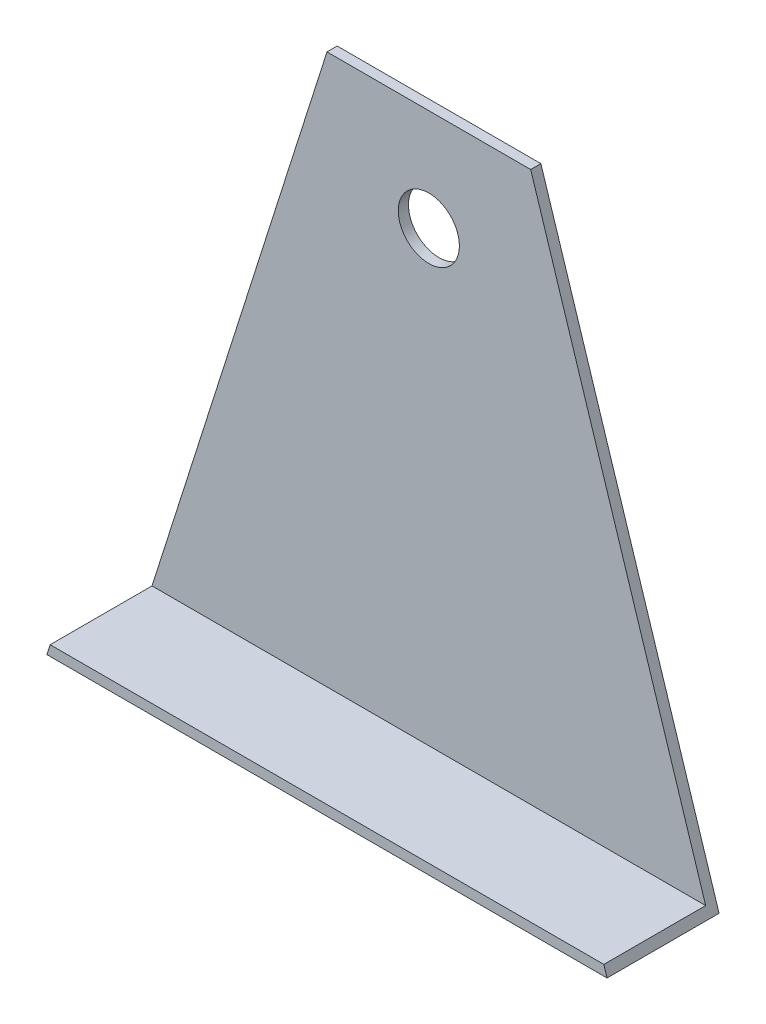
ISO-10303-21;
HEADER;
FILE_DESCRIPTION(('STEP AP214'),'2;1');
FILE_NAME('part.step','',(''),(''),'','','');
FILE_SCHEMA(('AUTOMOTIVE_DESIGN { 1 0 10303 214 1 1 1 1 }'));
ENDSEC;
DATA;
#1=APPLICATION_CONTEXT('core data for automotive mechanical design processes');
#2=APPLICATION_PROTOCOL_DEFINITION('international standard','automotive_design',2000,#1);
#3=PRODUCT_CONTEXT('',#1,'mechanical');
#4=PRODUCT('Part','Part','',(#3));
#5=PRODUCT_RELATED_PRODUCT_CATEGORY('part','',(#4));
#6=PRODUCT_DEFINITION_FORMATION('','',#4);
#7=PRODUCT_DEFINITION_CONTEXT('part definition',#1,'design');
#8=PRODUCT_DEFINITION('design','',#6,#7);
#9=PRODUCT_DEFINITION_SHAPE('','',#8);
#10=(LENGTH_UNIT() NAMED_UNIT(*) SI_UNIT(.MILLI.,.METRE.));
#11=(NAMED_UNIT(*) PLANE_ANGLE_UNIT() SI_UNIT($,.RADIAN.));
#12=(NAMED_UNIT(*) SI_UNIT($,.STERADIAN.) SOLID_ANGLE_UNIT());
#13=UNCERTAINTY_MEASURE_WITH_UNIT(LENGTH_MEASURE(1.E-05),#10,'distance_accuracy_value','');
#14=(GEOMETRIC_REPRESENTATION_CONTEXT(3) GLOBAL_UNCERTAINTY_ASSIGNED_CONTEXT((#13)) GLOBAL_UNIT_ASSIGNED_CONTEXT((#10,
#11,#12)) REPRESENTATION_CONTEXT('',''));
#15=CARTESIAN_POINT('',(0.,0.,0.));
#16=DIRECTION('',(0.,0.,1.));
#17=DIRECTION('',(1.,0.,0.));
#18=AXIS2_PLACEMENT_3D('',#15,#16,#17);
#19=CARTESIAN_POINT('',(-20.,110.,2.));
#20=DIRECTION('',(0.952925780013262,-0.303203657276947,0.));
#21=DIRECTION('',(0.303203657276947,0.952925780013262,0.));
#22=AXIS2_PLACEMENT_3D('',#19,#20,#21);
#23=PLANE('',#22);
#24=DIRECTION('',(-0.303203657276947,-0.952925780013262,0.));
#25=VECTOR('',#24,1.);
#26=CARTESIAN_POINT('',(-20.,110.,0.));
#27=LINE('',#26,#25);
#28=CARTESIAN_POINT('',(-20.,110.,0.));
#29=VERTEX_POINT('',#28);
#30=CARTESIAN_POINT('',(-55.,0.,0.));
#31=VERTEX_POINT('',#30);
#32=EDGE_CURVE('E92',#29,#31,#27,.T.);
#33=ORIENTED_EDGE('',*,*,#32,.T.);
#34=DIRECTION('',(0.,0.,-1.));
#35=VECTOR('',#34,1.);
#36=CARTESIAN_POINT('',(-55.,0.,2.));
#37=LINE('',#36,#35);
#38=CARTESIAN_POINT('',(-55.,0.,22.));
#39=VERTEX_POINT('',#38);
#40=EDGE_CURVE('E11',#39,#31,#37,.T.);
#41=ORIENTED_EDGE('',*,*,#40,.F.);
#42=DIRECTION('',(-0.303203657276943,-0.952925780013263,0.));
#43=VECTOR('',#42,1.);
#44=CARTESIAN_POINT('',(-55.,0.,22.));
#45=LINE('',#44,#43);
#46=CARTESIAN_POINT('',(-54.3636363636364,1.99999999999999,22.));
#47=VERTEX_POINT('',#46);
#48=EDGE_CURVE('E122',#47,#39,#45,.T.);
#49=ORIENTED_EDGE('',*,*,#48,.F.);
#50=DIRECTION('',(0.,0.,-1.));
#51=VECTOR('',#50,1.);
#52=CARTESIAN_POINT('',(-54.3636363636364,1.99999999999999,22.));
#53=LINE('',#52,#51);
#54=CARTESIAN_POINT('',(-54.3636363636364,1.99999999999999,2.));
#55=VERTEX_POINT('',#54);
#56=EDGE_CURVE('E126',#47,#55,#53,.T.);
#57=ORIENTED_EDGE('',*,*,#56,.T.);
#58=DIRECTION('',(-0.303203657276947,-0.952925780013262,0.));
#59=VECTOR('',#58,1.);
#60=CARTESIAN_POINT('',(-20.,110.,2.));
#61=LINE('',#60,#59);
#62=CARTESIAN_POINT('',(-20.,110.,2.));
#63=VERTEX_POINT('',#62);
#64=EDGE_CURVE('E86',#63,#55,#61,.T.);
#65=ORIENTED_EDGE('',*,*,#64,.F.);
#66=DIRECTION('',(0.,0.,-1.));
#67=VECTOR('',#66,1.);
#68=CARTESIAN_POINT('',(-20.,110.,2.));
#69=LINE('',#68,#67);
#70=EDGE_CURVE('E79',#63,#29,#69,.T.);
#71=ORIENTED_EDGE('',*,*,#70,.T.);
#72=EDGE_LOOP('',(#33,#41,#49,#57,#65,#71));
#73=FACE_BOUND('',#72,.T.);
#74=ADVANCED_FACE('F35',(#73),#23,.F.);
#75=CARTESIAN_POINT('',(-55.,0.,2.));
#76=DIRECTION('',(0.,1.,0.));
#77=DIRECTION('',(0.,0.,1.));
#78=AXIS2_PLACEMENT_3D('',#75,#76,#77);
#79=PLANE('',#78);
#80=DIRECTION('',(1.,0.,0.));
#81=VECTOR('',#80,1.);
#82=CARTESIAN_POINT('',(-55.,0.,0.));
#83=LINE('',#82,#81);
#84=CARTESIAN_POINT('',(55.,0.,0.));
#85=VERTEX_POINT('',#84);
#86=EDGE_CURVE('E96',#31,#85,#83,.T.);
#87=ORIENTED_EDGE('',*,*,#86,.T.);
#88=DIRECTION('',(0.,0.,-1.));
#89=VECTOR('',#88,1.);
#90=CARTESIAN_POINT('',(55.,0.,2.));
#91=LINE('',#90,#89);
#92=CARTESIAN_POINT('',(55.,0.,22.));
#93=VERTEX_POINT('',#92);
#94=EDGE_CURVE('E43',#93,#85,#91,.T.);
#95=ORIENTED_EDGE('',*,*,#94,.F.);
#96=DIRECTION('',(1.,0.,0.));
#97=VECTOR('',#96,1.);
#98=CARTESIAN_POINT('',(55.,0.,22.));
#99=LINE('',#98,#97);
#100=EDGE_CURVE('E125',#39,#93,#99,.T.);
#101=ORIENTED_EDGE('',*,*,#100,.F.);
#102=ORIENTED_EDGE('',*,*,#40,.T.);
#103=EDGE_LOOP('',(#87,#95,#101,#102));
#104=FACE_BOUND('',#103,.T.);
#105=ADVANCED_FACE('F173',(#104),#79,.F.);
#106=CARTESIAN_POINT('',(55.,0.,2.));
#107=DIRECTION('',(-0.952925780013262,-0.303203657276947,0.));
#108=DIRECTION('',(0.303203657276947,-0.952925780013262,0.));
#109=AXIS2_PLACEMENT_3D('',#106,#107,#108);
#110=PLANE('',#109);
#111=DIRECTION('',(-0.303203657276947,0.952925780013262,0.));
#112=VECTOR('',#111,1.);
#113=CARTESIAN_POINT('',(55.,0.,0.));
#114=LINE('',#113,#112);
#115=CARTESIAN_POINT('',(20.,110.,0.));
#116=VERTEX_POINT('',#115);
#117=EDGE_CURVE('E87',#85,#116,#114,.T.);
#118=ORIENTED_EDGE('',*,*,#117,.T.);
#119=DIRECTION('',(0.,0.,-1.));
#120=VECTOR('',#119,1.);
#121=CARTESIAN_POINT('',(20.,110.,2.));
#122=LINE('',#121,#120);
#123=CARTESIAN_POINT('',(20.,110.,2.));
#124=VERTEX_POINT('',#123);
#125=EDGE_CURVE('E82',#124,#116,#122,.T.);
#126=ORIENTED_EDGE('',*,*,#125,.F.);
#127=DIRECTION('',(-0.303203657276947,0.952925780013262,0.));
#128=VECTOR('',#127,1.);
#129=CARTESIAN_POINT('',(55.,0.,2.));
#130=LINE('',#129,#128);
#131=CARTESIAN_POINT('',(54.3636363636364,2.,2.));
#132=VERTEX_POINT('',#131);
#133=EDGE_CURVE('E112',#132,#124,#130,.T.);
#134=ORIENTED_EDGE('',*,*,#133,.F.);
#135=DIRECTION('',(0.,0.,-1.));
#136=VECTOR('',#135,1.);
#137=CARTESIAN_POINT('',(54.3636363636364,1.99999999999999,22.));
#138=LINE('',#137,#136);
#139=CARTESIAN_POINT('',(54.3636363636364,1.99999999999999,22.));
#140=VERTEX_POINT('',#139);
#141=EDGE_CURVE('E118',#140,#132,#138,.T.);
#142=ORIENTED_EDGE('',*,*,#141,.F.);
#143=DIRECTION('',(-0.303203657276946,0.952925780013262,0.));
#144=VECTOR('',#143,1.);
#145=CARTESIAN_POINT('',(54.3636363636364,1.99999999999999,22.));
#146=LINE('',#145,#144);
#147=EDGE_CURVE('E144',#93,#140,#146,.T.);
#148=ORIENTED_EDGE('',*,*,#147,.F.);
#149=ORIENTED_EDGE('',*,*,#94,.T.);
#150=EDGE_LOOP('',(#118,#126,#134,#142,#148,#149));
#151=FACE_BOUND('',#150,.T.);
#152=ADVANCED_FACE('F141',(#151),#110,.F.);
#153=CARTESIAN_POINT('',(20.,110.,2.));
#154=DIRECTION('',(0.,-1.,0.));
#155=DIRECTION('',(1.,0.,0.));
#156=AXIS2_PLACEMENT_3D('',#153,#154,#155);
#157=PLANE('',#156);
#158=DIRECTION('',(-1.,0.,0.));
#159=VECTOR('',#158,1.);
#160=CARTESIAN_POINT('',(20.,110.,0.));
#161=LINE('',#160,#159);
#162=EDGE_CURVE('E76',#116,#29,#161,.T.);
#163=ORIENTED_EDGE('',*,*,#162,.T.);
#164=ORIENTED_EDGE('',*,*,#70,.F.);
#165=DIRECTION('',(-1.,0.,0.));
#166=VECTOR('',#165,1.);
#167=CARTESIAN_POINT('',(20.,110.,2.));
#168=LINE('',#167,#166);
#169=EDGE_CURVE('E57',#124,#63,#168,.T.);
#170=ORIENTED_EDGE('',*,*,#169,.F.);
#171=ORIENTED_EDGE('',*,*,#125,.T.);
#172=EDGE_LOOP('',(#163,#164,#170,#171));
#173=FACE_BOUND('',#172,.T.);
#174=ADVANCED_FACE('F78',(#173),#157,.F.);
#175=CARTESIAN_POINT('',(0.,0.,2.));
#176=DIRECTION('',(0.,0.,1.));
#177=DIRECTION('',(1.,0.,0.));
#178=AXIS2_PLACEMENT_3D('',#175,#176,#177);
#179=PLANE('',#178);
#180=DIRECTION('',(-1.,0.,0.));
#181=VECTOR('',#180,1.);
#182=CARTESIAN_POINT('',(-54.3636363636364,1.99999999999999,2.));
#183=LINE('',#182,#181);
#184=EDGE_CURVE('E51',#132,#55,#183,.T.);
#185=ORIENTED_EDGE('',*,*,#184,.F.);
#186=ORIENTED_EDGE('',*,*,#133,.T.);
#187=ORIENTED_EDGE('',*,*,#169,.T.);
#188=ORIENTED_EDGE('',*,*,#64,.T.);
#189=EDGE_LOOP('',(#185,#186,#187,#188));
#190=FACE_BOUND('',#189,.T.);
#191=CARTESIAN_POINT('',(0.,90.,2.));
#192=DIRECTION('',(0.,0.,1.));
#193=DIRECTION('',(1.,0.,0.));
#194=AXIS2_PLACEMENT_3D('',#191,#192,#193);
#195=CIRCLE('',#194,6.);
#196=CARTESIAN_POINT('',(6.,90.,2.));
#197=VERTEX_POINT('',#196);
#198=EDGE_CURVE('E101',#197,#197,#195,.T.);
#199=ORIENTED_EDGE('',*,*,#198,.F.);
#200=EDGE_LOOP('',(#199));
#201=FACE_BOUND('',#200,.T.);
#202=ADVANCED_FACE('F153',(#190,#201),#179,.T.);
#203=CARTESIAN_POINT('',(0.,0.,0.));
#204=DIRECTION('',(0.,0.,1.));
#205=DIRECTION('',(1.,0.,0.));
#206=AXIS2_PLACEMENT_3D('',#203,#204,#205);
#207=PLANE('',#206);
#208=CARTESIAN_POINT('',(0.,90.,0.));
#209=DIRECTION('',(0.,0.,1.));
#210=DIRECTION('',(1.,0.,0.));
#211=AXIS2_PLACEMENT_3D('',#208,#209,#210);
#212=CIRCLE('',#211,6.);
#213=CARTESIAN_POINT('',(6.,90.,0.));
#214=VERTEX_POINT('',#213);
#215=EDGE_CURVE('E97',#214,#214,#212,.T.);
#216=ORIENTED_EDGE('',*,*,#215,.T.);
#217=EDGE_LOOP('',(#216));
#218=FACE_BOUND('',#217,.T.);
#219=ORIENTED_EDGE('',*,*,#32,.F.);
#220=ORIENTED_EDGE('',*,*,#162,.F.);
#221=ORIENTED_EDGE('',*,*,#117,.F.);
#222=ORIENTED_EDGE('',*,*,#86,.F.);
#223=EDGE_LOOP('',(#219,#220,#221,#222));
#224=FACE_BOUND('',#223,.T.);
#225=ADVANCED_FACE('F95',(#218,#224),#207,.F.);
#226=CARTESIAN_POINT('',(0.,90.,0.));
#227=DIRECTION('',(0.,0.,1.));
#228=DIRECTION('',(1.,0.,0.));
#229=AXIS2_PLACEMENT_3D('',#226,#227,#228);
#230=CYLINDRICAL_SURFACE('',#229,6.);
#231=ORIENTED_EDGE('',*,*,#215,.F.);
#232=EDGE_LOOP('',(#231));
#233=FACE_BOUND('',#232,.T.);
#234=ORIENTED_EDGE('',*,*,#198,.T.);
#235=EDGE_LOOP('',(#234));
#236=FACE_BOUND('',#235,.T.);
#237=ADVANCED_FACE('F159',(#233,#236),#230,.F.);
#238=CARTESIAN_POINT('',(-54.3636363636364,1.99999999999999,22.));
#239=DIRECTION('',(0.,-1.,0.));
#240=DIRECTION('',(1.,0.,0.));
#241=AXIS2_PLACEMENT_3D('',#238,#239,#240);
#242=PLANE('',#241);
#243=ORIENTED_EDGE('',*,*,#184,.T.);
#244=ORIENTED_EDGE('',*,*,#56,.F.);
#245=DIRECTION('',(-1.,0.,0.));
#246=VECTOR('',#245,1.);
#247=CARTESIAN_POINT('',(-54.3636363636364,1.99999999999999,22.));
#248=LINE('',#247,#246);
#249=EDGE_CURVE('E138',#140,#47,#248,.T.);
#250=ORIENTED_EDGE('',*,*,#249,.F.);
#251=ORIENTED_EDGE('',*,*,#141,.T.);
#252=EDGE_LOOP('',(#243,#244,#250,#251));
#253=FACE_BOUND('',#252,.T.);
#254=ADVANCED_FACE('F133',(#253),#242,.F.);
#255=CARTESIAN_POINT('',(0.,0.,22.));
#256=DIRECTION('',(0.,0.,-1.));
#257=DIRECTION('',(-1.,0.,0.));
#258=AXIS2_PLACEMENT_3D('',#255,#256,#257);
#259=PLANE('',#258);
#260=ORIENTED_EDGE('',*,*,#100,.T.);
#261=ORIENTED_EDGE('',*,*,#147,.T.);
#262=ORIENTED_EDGE('',*,*,#249,.T.);
#263=ORIENTED_EDGE('',*,*,#48,.T.);
#264=EDGE_LOOP('',(#260,#261,#262,#263));
#265=FACE_BOUND('',#264,.T.);
#266=ADVANCED_FACE('F167',(#265),#259,.F.);
#267=CLOSED_SHELL('',(#74,#105,#152,#174,#202,#225,#237,#254,#266));
#268=MANIFOLD_SOLID_BREP('B2',#267);
#269=ADVANCED_BREP_SHAPE_REPRESENTATION('',(#18,#268),#14);
#270=SHAPE_DEFINITION_REPRESENTATION(#9,#269);
ENDSEC;
END-ISO-10303-21;
